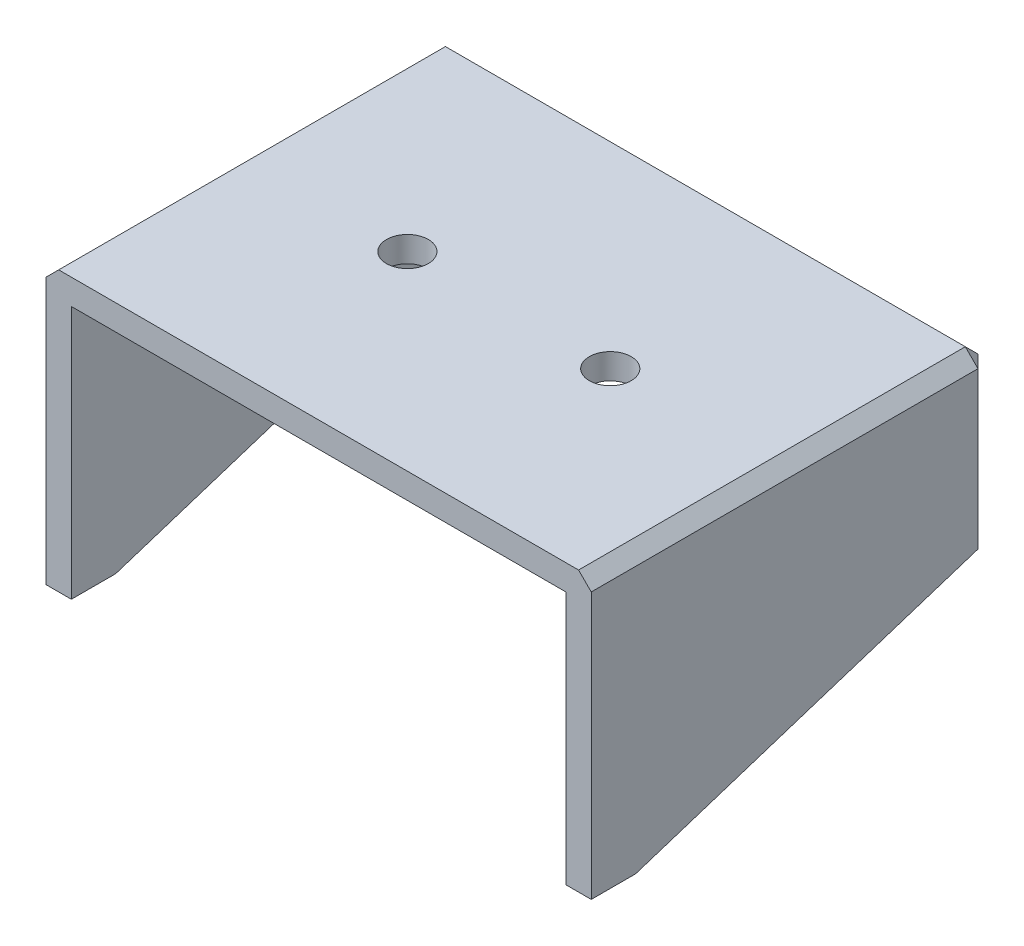
ISO-10303-21;
HEADER;
FILE_DESCRIPTION(('STEP AP214'),'2;1');
FILE_NAME('part.step','',(''),(''),'','','');
FILE_SCHEMA(('AUTOMOTIVE_DESIGN { 1 0 10303 214 1 1 1 1 }'));
ENDSEC;
DATA;
#1=APPLICATION_CONTEXT('core data for automotive mechanical design processes');
#2=APPLICATION_PROTOCOL_DEFINITION('international standard','automotive_design',2000,#1);
#3=PRODUCT_CONTEXT('',#1,'mechanical');
#4=PRODUCT('Part','Part','',(#3));
#5=PRODUCT_RELATED_PRODUCT_CATEGORY('part','',(#4));
#6=PRODUCT_DEFINITION_FORMATION('','',#4);
#7=PRODUCT_DEFINITION_CONTEXT('part definition',#1,'design');
#8=PRODUCT_DEFINITION('design','',#6,#7);
#9=PRODUCT_DEFINITION_SHAPE('','',#8);
#10=(LENGTH_UNIT() NAMED_UNIT(*) SI_UNIT(.MILLI.,.METRE.));
#11=(NAMED_UNIT(*) PLANE_ANGLE_UNIT() SI_UNIT($,.RADIAN.));
#12=(NAMED_UNIT(*) SI_UNIT($,.STERADIAN.) SOLID_ANGLE_UNIT());
#13=UNCERTAINTY_MEASURE_WITH_UNIT(LENGTH_MEASURE(1.E-05),#10,'distance_accuracy_value','');
#14=(GEOMETRIC_REPRESENTATION_CONTEXT(3) GLOBAL_UNCERTAINTY_ASSIGNED_CONTEXT((#13)) GLOBAL_UNIT_ASSIGNED_CONTEXT((#10,
#11,#12)) REPRESENTATION_CONTEXT('',''));
#15=CARTESIAN_POINT('',(0.,0.,0.));
#16=DIRECTION('',(0.,0.,1.));
#17=DIRECTION('',(1.,0.,0.));
#18=AXIS2_PLACEMENT_3D('',#15,#16,#17);
#19=CARTESIAN_POINT('',(0.,0.,0.));
#20=DIRECTION('',(0.,1.,0.));
#21=DIRECTION('',(0.,0.,1.));
#22=AXIS2_PLACEMENT_3D('',#19,#20,#21);
#23=PLANE('',#22);
#24=CARTESIAN_POINT('',(8.,0.,6.01690821256042));
#25=DIRECTION('',(0.,-1.,0.));
#26=DIRECTION('',(0.,0.,-1.));
#27=AXIS2_PLACEMENT_3D('',#24,#25,#26);
#28=CIRCLE('',#27,1.65);
#29=CARTESIAN_POINT('',(8.,0.,4.36690821256042));
#30=VERTEX_POINT('',#29);
#31=EDGE_CURVE('E198',#30,#30,#28,.T.);
#32=ORIENTED_EDGE('',*,*,#31,.F.);
#33=EDGE_LOOP('',(#32));
#34=FACE_BOUND('',#33,.T.);
#35=CARTESIAN_POINT('',(-8.,0.,6.01690821256042));
#36=DIRECTION('',(0.,-1.,0.));
#37=DIRECTION('',(0.,0.,-1.));
#38=AXIS2_PLACEMENT_3D('',#35,#36,#37);
#39=CIRCLE('',#38,1.65);
#40=CARTESIAN_POINT('',(-8.,0.,4.36690821256042));
#41=VERTEX_POINT('',#40);
#42=EDGE_CURVE('E202',#41,#41,#39,.T.);
#43=ORIENTED_EDGE('',*,*,#42,.F.);
#44=EDGE_LOOP('',(#43));
#45=FACE_BOUND('',#44,.T.);
#46=DIRECTION('',(-1.,0.,0.));
#47=VECTOR('',#46,1.);
#48=CARTESIAN_POINT('',(19.5,0.,-8.98309178743959));
#49=LINE('',#48,#47);
#50=CARTESIAN_POINT('',(19.5,0.,-8.98309178743959));
#51=VERTEX_POINT('',#50);
#52=CARTESIAN_POINT('',(-19.5,0.,-8.98309178743959));
#53=VERTEX_POINT('',#52);
#54=EDGE_CURVE('E206',#51,#53,#49,.T.);
#55=ORIENTED_EDGE('',*,*,#54,.F.);
#56=DIRECTION('',(0.,0.,-1.));
#57=VECTOR('',#56,1.);
#58=CARTESIAN_POINT('',(19.5,0.,21.0169082125604));
#59=LINE('',#58,#57);
#60=CARTESIAN_POINT('',(19.5,0.,21.0169082125604));
#61=VERTEX_POINT('',#60);
#62=EDGE_CURVE('E220',#61,#51,#59,.T.);
#63=ORIENTED_EDGE('',*,*,#62,.F.);
#64=DIRECTION('',(1.,0.,0.));
#65=VECTOR('',#64,1.);
#66=CARTESIAN_POINT('',(-21.5,0.,21.0169082125604));
#67=LINE('',#66,#65);
#68=CARTESIAN_POINT('',(-19.5,0.,21.0169082125604));
#69=VERTEX_POINT('',#68);
#70=EDGE_CURVE('E241',#69,#61,#67,.T.);
#71=ORIENTED_EDGE('',*,*,#70,.F.);
#72=DIRECTION('',(0.,0.,-1.));
#73=VECTOR('',#72,1.);
#74=CARTESIAN_POINT('',(-19.5,0.,21.0169082125604));
#75=LINE('',#74,#73);
#76=EDGE_CURVE('E217',#69,#53,#75,.T.);
#77=ORIENTED_EDGE('',*,*,#76,.T.);
#78=EDGE_LOOP('',(#55,#63,#71,#77));
#79=FACE_BOUND('',#78,.T.);
#80=ADVANCED_FACE('F37',(#34,#45,#79),#23,.F.);
#81=CARTESIAN_POINT('',(19.5,-20.,21.0169082125604));
#82=DIRECTION('',(1.,0.,0.));
#83=DIRECTION('',(0.,0.,-1.));
#84=AXIS2_PLACEMENT_3D('',#81,#82,#83);
#85=PLANE('',#84);
#86=DIRECTION('',(0.,1.,0.));
#87=VECTOR('',#86,1.);
#88=CARTESIAN_POINT('',(19.5,-11.,-8.98309178743959));
#89=LINE('',#88,#87);
#90=CARTESIAN_POINT('',(19.5,-7.,-8.98309178743959));
#91=VERTEX_POINT('',#90);
#92=EDGE_CURVE('E212',#91,#51,#89,.T.);
#93=ORIENTED_EDGE('',*,*,#92,.F.);
#94=DIRECTION('',(0.,0.,-1.));
#95=VECTOR('',#94,1.);
#96=CARTESIAN_POINT('',(19.5,-7.,-0.483091787439589));
#97=LINE('',#96,#95);
#98=CARTESIAN_POINT('',(19.5,-7.,-10.4830917874396));
#99=VERTEX_POINT('',#98);
#100=EDGE_CURVE('E157',#91,#99,#97,.T.);
#101=ORIENTED_EDGE('',*,*,#100,.T.);
#102=DIRECTION('',(0.,-1.,0.));
#103=VECTOR('',#102,1.);
#104=CARTESIAN_POINT('',(19.5,-11.,-10.4830917874396));
#105=LINE('',#104,#103);
#106=CARTESIAN_POINT('',(19.5,-11.,-10.4830917874396));
#107=VERTEX_POINT('',#106);
#108=EDGE_CURVE('E151',#99,#107,#105,.T.);
#109=ORIENTED_EDGE('',*,*,#108,.T.);
#110=DIRECTION('',(0.,-0.306009180413121,0.952028561285264));
#111=VECTOR('',#110,1.);
#112=CARTESIAN_POINT('',(19.5,-21.0196531791908,20.6891625478205));
#113=LINE('',#112,#111);
#114=CARTESIAN_POINT('',(19.5,-20.,17.5169082125604));
#115=VERTEX_POINT('',#114);
#116=EDGE_CURVE('E155',#107,#115,#113,.T.);
#117=ORIENTED_EDGE('',*,*,#116,.T.);
#118=DIRECTION('',(0.,0.,-1.));
#119=VECTOR('',#118,1.);
#120=CARTESIAN_POINT('',(19.5,-20.,21.0169082125604));
#121=LINE('',#120,#119);
#122=CARTESIAN_POINT('',(19.5,-20.,21.0169082125604));
#123=VERTEX_POINT('',#122);
#124=EDGE_CURVE('E229',#123,#115,#121,.T.);
#125=ORIENTED_EDGE('',*,*,#124,.F.);
#126=DIRECTION('',(0.,1.,0.));
#127=VECTOR('',#126,1.);
#128=CARTESIAN_POINT('',(19.5,-20.,21.0169082125604));
#129=LINE('',#128,#127);
#130=EDGE_CURVE('E236',#123,#61,#129,.T.);
#131=ORIENTED_EDGE('',*,*,#130,.T.);
#132=ORIENTED_EDGE('',*,*,#62,.T.);
#133=EDGE_LOOP('',(#93,#101,#109,#117,#125,#131,#132));
#134=FACE_BOUND('',#133,.T.);
#135=ADVANCED_FACE('F153',(#134),#85,.F.);
#136=CARTESIAN_POINT('',(-19.5,-20.,21.0169082125604));
#137=DIRECTION('',(1.,0.,0.));
#138=DIRECTION('',(0.,0.,-1.));
#139=AXIS2_PLACEMENT_3D('',#136,#137,#138);
#140=PLANE('',#139);
#141=DIRECTION('',(0.,0.,-1.));
#142=VECTOR('',#141,1.);
#143=CARTESIAN_POINT('',(-19.5,-7.,-0.483091787439589));
#144=LINE('',#143,#142);
#145=CARTESIAN_POINT('',(-19.5,-7.,-8.98309178743959));
#146=VERTEX_POINT('',#145);
#147=CARTESIAN_POINT('',(-19.5,-7.,-10.4830917874396));
#148=VERTEX_POINT('',#147);
#149=EDGE_CURVE('E177',#146,#148,#144,.T.);
#150=ORIENTED_EDGE('',*,*,#149,.F.);
#151=DIRECTION('',(0.,1.,0.));
#152=VECTOR('',#151,1.);
#153=CARTESIAN_POINT('',(-19.5,-11.,-8.98309178743959));
#154=LINE('',#153,#152);
#155=EDGE_CURVE('E209',#146,#53,#154,.T.);
#156=ORIENTED_EDGE('',*,*,#155,.T.);
#157=ORIENTED_EDGE('',*,*,#76,.F.);
#158=DIRECTION('',(0.,1.,0.));
#159=VECTOR('',#158,1.);
#160=CARTESIAN_POINT('',(-19.5,-20.,21.0169082125604));
#161=LINE('',#160,#159);
#162=CARTESIAN_POINT('',(-19.5,-20.,21.0169082125604));
#163=VERTEX_POINT('',#162);
#164=EDGE_CURVE('E214',#163,#69,#161,.T.);
#165=ORIENTED_EDGE('',*,*,#164,.F.);
#166=DIRECTION('',(0.,0.,-1.));
#167=VECTOR('',#166,1.);
#168=CARTESIAN_POINT('',(-19.5,-20.,21.0169082125604));
#169=LINE('',#168,#167);
#170=CARTESIAN_POINT('',(-19.5,-20.,17.5169082125604));
#171=VERTEX_POINT('',#170);
#172=EDGE_CURVE('E221',#163,#171,#169,.T.);
#173=ORIENTED_EDGE('',*,*,#172,.T.);
#174=DIRECTION('',(0.,-0.306009180413121,0.952028561285264));
#175=VECTOR('',#174,1.);
#176=CARTESIAN_POINT('',(-19.5,-21.0196531791908,20.6891625478205));
#177=LINE('',#176,#175);
#178=CARTESIAN_POINT('',(-19.5,-11.,-10.4830917874396));
#179=VERTEX_POINT('',#178);
#180=EDGE_CURVE('E167',#179,#171,#177,.T.);
#181=ORIENTED_EDGE('',*,*,#180,.F.);
#182=DIRECTION('',(0.,1.,0.));
#183=VECTOR('',#182,1.);
#184=CARTESIAN_POINT('',(-19.5,-11.,-10.4830917874396));
#185=LINE('',#184,#183);
#186=EDGE_CURVE('E161',#179,#148,#185,.T.);
#187=ORIENTED_EDGE('',*,*,#186,.T.);
#188=EDGE_LOOP('',(#150,#156,#157,#165,#173,#181,#187));
#189=FACE_BOUND('',#188,.T.);
#190=ADVANCED_FACE('F345',(#189),#140,.T.);
#191=CARTESIAN_POINT('',(-21.5,2.,-10.4830917874396));
#192=DIRECTION('',(1.,0.,0.));
#193=DIRECTION('',(0.,0.,-1.));
#194=AXIS2_PLACEMENT_3D('',#191,#192,#193);
#195=PLANE('',#194);
#196=DIRECTION('',(0.,-1.,0.));
#197=VECTOR('',#196,1.);
#198=CARTESIAN_POINT('',(-21.5,2.,-9.48309178743959));
#199=LINE('',#198,#197);
#200=CARTESIAN_POINT('',(-21.5,0.999999999999992,-9.48309178743959));
#201=VERTEX_POINT('',#200);
#202=CARTESIAN_POINT('',(-21.5,-11.3214285714286,-9.48309178743959));
#203=VERTEX_POINT('',#202);
#204=EDGE_CURVE('E260',#201,#203,#199,.T.);
#205=ORIENTED_EDGE('',*,*,#204,.T.);
#206=DIRECTION('',(0.,-0.306009180413121,0.952028561285264));
#207=VECTOR('',#206,1.);
#208=CARTESIAN_POINT('',(-21.5,-9.78265895953757,-14.2703750244338));
#209=LINE('',#208,#207);
#210=CARTESIAN_POINT('',(-21.5,-20.,17.5169082125604));
#211=VERTEX_POINT('',#210);
#212=EDGE_CURVE('E60',#203,#211,#209,.T.);
#213=ORIENTED_EDGE('',*,*,#212,.T.);
#214=DIRECTION('',(0.,0.,-1.));
#215=VECTOR('',#214,1.);
#216=CARTESIAN_POINT('',(-21.5,-20.,21.0169082125604));
#217=LINE('',#216,#215);
#218=CARTESIAN_POINT('',(-21.5,-20.,21.0169082125604));
#219=VERTEX_POINT('',#218);
#220=EDGE_CURVE('E216',#219,#211,#217,.T.);
#221=ORIENTED_EDGE('',*,*,#220,.F.);
#222=DIRECTION('',(0.,-1.,0.));
#223=VECTOR('',#222,1.);
#224=CARTESIAN_POINT('',(-21.5,2.,21.0169082125604));
#225=LINE('',#224,#223);
#226=CARTESIAN_POINT('',(-21.5,0.999999999999992,21.0169082125604));
#227=VERTEX_POINT('',#226);
#228=EDGE_CURVE('E248',#227,#219,#225,.T.);
#229=ORIENTED_EDGE('',*,*,#228,.F.);
#230=DIRECTION('',(0.,0.,-1.));
#231=VECTOR('',#230,1.);
#232=CARTESIAN_POINT('',(-21.5,0.999999999999992,-10.4830917874396));
#233=LINE('',#232,#231);
#234=EDGE_CURVE('E250',#227,#201,#233,.T.);
#235=ORIENTED_EDGE('',*,*,#234,.T.);
#236=EDGE_LOOP('',(#205,#213,#221,#229,#235));
#237=FACE_BOUND('',#236,.T.);
#238=ADVANCED_FACE('F353',(#237),#195,.F.);
#239=CARTESIAN_POINT('',(-21.5,2.,21.0169082125604));
#240=DIRECTION('',(0.,0.,-1.));
#241=DIRECTION('',(-1.,0.,0.));
#242=AXIS2_PLACEMENT_3D('',#239,#240,#241);
#243=PLANE('',#242);
#244=DIRECTION('',(1.,0.,0.));
#245=VECTOR('',#244,1.);
#246=CARTESIAN_POINT('',(-21.5,2.,21.0169082125604));
#247=LINE('',#246,#245);
#248=CARTESIAN_POINT('',(-20.5,2.,21.0169082125604));
#249=VERTEX_POINT('',#248);
#250=CARTESIAN_POINT('',(20.5,2.,21.0169082125604));
#251=VERTEX_POINT('',#250);
#252=EDGE_CURVE('E242',#249,#251,#247,.T.);
#253=ORIENTED_EDGE('',*,*,#252,.F.);
#254=DIRECTION('',(-0.707106781186545,-0.70710678118655,0.));
#255=VECTOR('',#254,1.);
#256=CARTESIAN_POINT('',(-20.5,2.,21.0169082125604));
#257=LINE('',#256,#255);
#258=EDGE_CURVE('E276',#249,#227,#257,.T.);
#259=ORIENTED_EDGE('',*,*,#258,.T.);
#260=ORIENTED_EDGE('',*,*,#228,.T.);
#261=DIRECTION('',(1.,0.,0.));
#262=VECTOR('',#261,1.);
#263=CARTESIAN_POINT('',(-21.5,-20.,21.0169082125604));
#264=LINE('',#263,#262);
#265=EDGE_CURVE('E224',#219,#163,#264,.T.);
#266=ORIENTED_EDGE('',*,*,#265,.T.);
#267=ORIENTED_EDGE('',*,*,#164,.T.);
#268=ORIENTED_EDGE('',*,*,#70,.T.);
#269=ORIENTED_EDGE('',*,*,#130,.F.);
#270=DIRECTION('',(-1.,0.,0.));
#271=VECTOR('',#270,1.);
#272=CARTESIAN_POINT('',(21.5,-20.,21.0169082125604));
#273=LINE('',#272,#271);
#274=CARTESIAN_POINT('',(21.5,-20.,21.0169082125604));
#275=VERTEX_POINT('',#274);
#276=EDGE_CURVE('E231',#275,#123,#273,.T.);
#277=ORIENTED_EDGE('',*,*,#276,.F.);
#278=DIRECTION('',(0.,-1.,0.));
#279=VECTOR('',#278,1.);
#280=CARTESIAN_POINT('',(21.5,2.,21.0169082125604));
#281=LINE('',#280,#279);
#282=CARTESIAN_POINT('',(21.5,0.999999999999992,21.0169082125604));
#283=VERTEX_POINT('',#282);
#284=EDGE_CURVE('E245',#283,#275,#281,.T.);
#285=ORIENTED_EDGE('',*,*,#284,.F.);
#286=DIRECTION('',(-0.707106781186545,0.70710678118655,0.));
#287=VECTOR('',#286,1.);
#288=CARTESIAN_POINT('',(20.5,2.,21.0169082125604));
#289=LINE('',#288,#287);
#290=EDGE_CURVE('E274',#283,#251,#289,.T.);
#291=ORIENTED_EDGE('',*,*,#290,.T.);
#292=EDGE_LOOP('',(#253,#259,#260,#266,#267,#268,#269,#277,#285,#291));
#293=FACE_BOUND('',#292,.T.);
#294=ADVANCED_FACE('F332',(#293),#243,.F.);
#295=CARTESIAN_POINT('',(21.5,2.,-10.4830917874396));
#296=DIRECTION('',(-1.,0.,0.));
#297=DIRECTION('',(0.,0.,1.));
#298=AXIS2_PLACEMENT_3D('',#295,#296,#297);
#299=PLANE('',#298);
#300=DIRECTION('',(0.,0.,-1.));
#301=VECTOR('',#300,1.);
#302=CARTESIAN_POINT('',(21.5,-20.,21.0169082125604));
#303=LINE('',#302,#301);
#304=CARTESIAN_POINT('',(21.5,-20.,17.5169082125604));
#305=VERTEX_POINT('',#304);
#306=EDGE_CURVE('E233',#275,#305,#303,.T.);
#307=ORIENTED_EDGE('',*,*,#306,.T.);
#308=DIRECTION('',(0.,0.306009180413121,-0.952028561285264));
#309=VECTOR('',#308,1.);
#310=CARTESIAN_POINT('',(21.5,-9.78265895953757,-14.2703750244338));
#311=LINE('',#310,#309);
#312=CARTESIAN_POINT('',(21.5,-11.3214285714286,-9.48309178743958));
#313=VERTEX_POINT('',#312);
#314=EDGE_CURVE('E186',#305,#313,#311,.T.);
#315=ORIENTED_EDGE('',*,*,#314,.T.);
#316=DIRECTION('',(0.,1.,0.));
#317=VECTOR('',#316,1.);
#318=CARTESIAN_POINT('',(21.5,2.,-9.48309178743958));
#319=LINE('',#318,#317);
#320=CARTESIAN_POINT('',(21.5,0.999999999999992,-9.48309178743958));
#321=VERTEX_POINT('',#320);
#322=EDGE_CURVE('E280',#313,#321,#319,.T.);
#323=ORIENTED_EDGE('',*,*,#322,.T.);
#324=DIRECTION('',(0.,0.,1.));
#325=VECTOR('',#324,1.);
#326=CARTESIAN_POINT('',(21.5,0.999999999999992,21.0169082125604));
#327=LINE('',#326,#325);
#328=EDGE_CURVE('E278',#321,#283,#327,.T.);
#329=ORIENTED_EDGE('',*,*,#328,.T.);
#330=ORIENTED_EDGE('',*,*,#284,.T.);
#331=EDGE_LOOP('',(#307,#315,#323,#329,#330));
#332=FACE_BOUND('',#331,.T.);
#333=ADVANCED_FACE('F328',(#332),#299,.F.);
#334=CARTESIAN_POINT('',(-21.5,2.,-10.4830917874396));
#335=DIRECTION('',(0.,0.,1.));
#336=DIRECTION('',(1.,0.,0.));
#337=AXIS2_PLACEMENT_3D('',#334,#335,#336);
#338=PLANE('',#337);
#339=DIRECTION('',(1.,0.,0.));
#340=VECTOR('',#339,1.);
#341=CARTESIAN_POINT('',(-69.5,-11.,-10.4830917874396));
#342=LINE('',#341,#340);
#343=CARTESIAN_POINT('',(20.5,-11.,-10.4830917874396));
#344=VERTEX_POINT('',#343);
#345=EDGE_CURVE('E52',#107,#344,#342,.T.);
#346=ORIENTED_EDGE('',*,*,#345,.F.);
#347=ORIENTED_EDGE('',*,*,#108,.F.);
#348=DIRECTION('',(1.,0.,0.));
#349=VECTOR('',#348,1.);
#350=CARTESIAN_POINT('',(19.5,-7.,-10.4830917874396));
#351=LINE('',#350,#349);
#352=EDGE_CURVE('E585',#148,#99,#351,.T.);
#353=ORIENTED_EDGE('',*,*,#352,.F.);
#354=ORIENTED_EDGE('',*,*,#186,.F.);
#355=CARTESIAN_POINT('',(-20.5,-11.,-10.4830917874396));
#356=VERTEX_POINT('',#355);
#357=EDGE_CURVE('E174',#356,#179,#342,.T.);
#358=ORIENTED_EDGE('',*,*,#357,.F.);
#359=DIRECTION('',(0.,1.,0.));
#360=VECTOR('',#359,1.);
#361=CARTESIAN_POINT('',(-20.5,2.,-10.4830917874396));
#362=LINE('',#361,#360);
#363=CARTESIAN_POINT('',(-20.5,0.999999999999992,-10.4830917874396));
#364=VERTEX_POINT('',#363);
#365=EDGE_CURVE('E266',#356,#364,#362,.T.);
#366=ORIENTED_EDGE('',*,*,#365,.T.);
#367=DIRECTION('',(1.,0.,0.));
#368=VECTOR('',#367,1.);
#369=CARTESIAN_POINT('',(21.5,0.999999999999992,-10.4830917874396));
#370=LINE('',#369,#368);
#371=CARTESIAN_POINT('',(20.5,0.999999999999992,-10.4830917874396));
#372=VERTEX_POINT('',#371);
#373=EDGE_CURVE('E263',#364,#372,#370,.T.);
#374=ORIENTED_EDGE('',*,*,#373,.T.);
#375=DIRECTION('',(0.,-1.,0.));
#376=VECTOR('',#375,1.);
#377=CARTESIAN_POINT('',(20.5,2.,-10.4830917874396));
#378=LINE('',#377,#376);
#379=EDGE_CURVE('E173',#372,#344,#378,.T.);
#380=ORIENTED_EDGE('',*,*,#379,.T.);
#381=EDGE_LOOP('',(#346,#347,#353,#354,#358,#366,#374,#380));
#382=FACE_BOUND('',#381,.T.);
#383=CARTESIAN_POINT('',(13.,-3.,-10.4830917874396));
#384=DIRECTION('',(0.,0.,-1.));
#385=DIRECTION('',(-1.,0.,0.));
#386=AXIS2_PLACEMENT_3D('',#383,#384,#385);
#387=CIRCLE('',#386,1.5);
#388=CARTESIAN_POINT('',(11.5,-3.,-10.4830917874396));
#389=VERTEX_POINT('',#388);
#390=EDGE_CURVE('E190',#389,#389,#387,.T.);
#391=ORIENTED_EDGE('',*,*,#390,.F.);
#392=EDGE_LOOP('',(#391));
#393=FACE_BOUND('',#392,.T.);
#394=CARTESIAN_POINT('',(-13.,-3.,-10.4830917874396));
#395=DIRECTION('',(0.,0.,-1.));
#396=DIRECTION('',(-1.,0.,0.));
#397=AXIS2_PLACEMENT_3D('',#394,#395,#396);
#398=CIRCLE('',#397,1.5);
#399=CARTESIAN_POINT('',(-14.5,-3.,-10.4830917874396));
#400=VERTEX_POINT('',#399);
#401=EDGE_CURVE('E194',#400,#400,#398,.T.);
#402=ORIENTED_EDGE('',*,*,#401,.F.);
#403=EDGE_LOOP('',(#402));
#404=FACE_BOUND('',#403,.T.);
#405=ADVANCED_FACE('F170',(#382,#393,#404),#338,.F.);
#406=CARTESIAN_POINT('',(0.,2.,0.));
#407=DIRECTION('',(0.,1.,0.));
#408=DIRECTION('',(0.,0.,1.));
#409=AXIS2_PLACEMENT_3D('',#406,#407,#408);
#410=PLANE('',#409);
#411=CARTESIAN_POINT('',(8.,2.,6.01690821256042));
#412=DIRECTION('',(0.,1.,0.));
#413=DIRECTION('',(0.,0.,1.));
#414=AXIS2_PLACEMENT_3D('',#411,#412,#413);
#415=CIRCLE('',#414,1.65);
#416=CARTESIAN_POINT('',(8.,2.,7.66690821256042));
#417=VERTEX_POINT('',#416);
#418=EDGE_CURVE('E210',#417,#417,#415,.T.);
#419=ORIENTED_EDGE('',*,*,#418,.F.);
#420=EDGE_LOOP('',(#419));
#421=FACE_BOUND('',#420,.T.);
#422=CARTESIAN_POINT('',(-8.,2.,6.01690821256042));
#423=DIRECTION('',(0.,1.,0.));
#424=DIRECTION('',(0.,0.,1.));
#425=AXIS2_PLACEMENT_3D('',#422,#423,#424);
#426=CIRCLE('',#425,1.65);
#427=CARTESIAN_POINT('',(-8.,2.,7.66690821256042));
#428=VERTEX_POINT('',#427);
#429=EDGE_CURVE('E201',#428,#428,#426,.T.);
#430=ORIENTED_EDGE('',*,*,#429,.F.);
#431=EDGE_LOOP('',(#430));
#432=FACE_BOUND('',#431,.T.);
#433=DIRECTION('',(-1.,0.,0.));
#434=VECTOR('',#433,1.);
#435=CARTESIAN_POINT('',(-21.5,2.,-9.48309178743959));
#436=LINE('',#435,#434);
#437=CARTESIAN_POINT('',(20.5,2.,-9.48309178743959));
#438=VERTEX_POINT('',#437);
#439=CARTESIAN_POINT('',(-20.5,2.,-9.48309178743959));
#440=VERTEX_POINT('',#439);
#441=EDGE_CURVE('E270',#438,#440,#436,.T.);
#442=ORIENTED_EDGE('',*,*,#441,.T.);
#443=DIRECTION('',(0.,0.,1.));
#444=VECTOR('',#443,1.);
#445=CARTESIAN_POINT('',(-20.5,2.,21.0169082125604));
#446=LINE('',#445,#444);
#447=EDGE_CURVE('E272',#440,#249,#446,.T.);
#448=ORIENTED_EDGE('',*,*,#447,.T.);
#449=ORIENTED_EDGE('',*,*,#252,.T.);
#450=DIRECTION('',(0.,0.,-1.));
#451=VECTOR('',#450,1.);
#452=CARTESIAN_POINT('',(20.5,2.,-10.4830917874396));
#453=LINE('',#452,#451);
#454=EDGE_CURVE('E268',#251,#438,#453,.T.);
#455=ORIENTED_EDGE('',*,*,#454,.T.);
#456=EDGE_LOOP('',(#442,#448,#449,#455));
#457=FACE_BOUND('',#456,.T.);
#458=ADVANCED_FACE('F358',(#421,#432,#457),#410,.T.);
#459=CARTESIAN_POINT('',(0.,-20.,0.));
#460=DIRECTION('',(0.,-1.,0.));
#461=DIRECTION('',(0.,0.,-1.));
#462=AXIS2_PLACEMENT_3D('',#459,#460,#461);
#463=PLANE('',#462);
#464=DIRECTION('',(1.,0.,0.));
#465=VECTOR('',#464,1.);
#466=CARTESIAN_POINT('',(-69.5,-20.,17.5169082125604));
#467=LINE('',#466,#465);
#468=EDGE_CURVE('E165',#115,#305,#467,.T.);
#469=ORIENTED_EDGE('',*,*,#468,.T.);
#470=ORIENTED_EDGE('',*,*,#306,.F.);
#471=ORIENTED_EDGE('',*,*,#276,.T.);
#472=ORIENTED_EDGE('',*,*,#124,.T.);
#473=EDGE_LOOP('',(#469,#470,#471,#472));
#474=FACE_BOUND('',#473,.T.);
#475=ADVANCED_FACE('F336',(#474),#463,.T.);
#476=CARTESIAN_POINT('',(0.,-20.,0.));
#477=DIRECTION('',(0.,1.,0.));
#478=DIRECTION('',(0.,0.,1.));
#479=AXIS2_PLACEMENT_3D('',#476,#477,#478);
#480=PLANE('',#479);
#481=ORIENTED_EDGE('',*,*,#220,.T.);
#482=EDGE_CURVE('E184',#211,#171,#467,.T.);
#483=ORIENTED_EDGE('',*,*,#482,.T.);
#484=ORIENTED_EDGE('',*,*,#172,.F.);
#485=ORIENTED_EDGE('',*,*,#265,.F.);
#486=EDGE_LOOP('',(#481,#483,#484,#485));
#487=FACE_BOUND('',#486,.T.);
#488=ADVANCED_FACE('F340',(#487),#480,.F.);
#489=CARTESIAN_POINT('',(19.5,-11.,-8.98309178743959));
#490=DIRECTION('',(0.,0.,-1.));
#491=DIRECTION('',(-1.,0.,0.));
#492=AXIS2_PLACEMENT_3D('',#489,#490,#491);
#493=PLANE('',#492);
#494=CARTESIAN_POINT('',(13.,-3.,-8.98309178743959));
#495=DIRECTION('',(0.,0.,-1.));
#496=DIRECTION('',(-1.,0.,0.));
#497=AXIS2_PLACEMENT_3D('',#494,#495,#496);
#498=CIRCLE('',#497,1.5);
#499=CARTESIAN_POINT('',(11.5,-3.,-8.98309178743959));
#500=VERTEX_POINT('',#499);
#501=EDGE_CURVE('E205',#500,#500,#498,.T.);
#502=ORIENTED_EDGE('',*,*,#501,.T.);
#503=EDGE_LOOP('',(#502));
#504=FACE_BOUND('',#503,.T.);
#505=CARTESIAN_POINT('',(-13.,-3.,-8.98309178743959));
#506=DIRECTION('',(0.,0.,-1.));
#507=DIRECTION('',(-1.,0.,0.));
#508=AXIS2_PLACEMENT_3D('',#505,#506,#507);
#509=CIRCLE('',#508,1.5);
#510=CARTESIAN_POINT('',(-14.5,-3.,-8.98309178743959));
#511=VERTEX_POINT('',#510);
#512=EDGE_CURVE('E193',#511,#511,#509,.T.);
#513=ORIENTED_EDGE('',*,*,#512,.T.);
#514=EDGE_LOOP('',(#513));
#515=FACE_BOUND('',#514,.T.);
#516=ORIENTED_EDGE('',*,*,#155,.F.);
#517=DIRECTION('',(1.,0.,0.));
#518=VECTOR('',#517,1.);
#519=CARTESIAN_POINT('',(19.5,-7.,-8.98309178743959));
#520=LINE('',#519,#518);
#521=EDGE_CURVE('E11',#146,#91,#520,.T.);
#522=ORIENTED_EDGE('',*,*,#521,.T.);
#523=ORIENTED_EDGE('',*,*,#92,.T.);
#524=ORIENTED_EDGE('',*,*,#54,.T.);
#525=EDGE_LOOP('',(#516,#522,#523,#524));
#526=FACE_BOUND('',#525,.T.);
#527=ADVANCED_FACE('F422',(#504,#515,#526),#493,.F.);
#528=CARTESIAN_POINT('',(-8.,12.,6.01690821256042));
#529=DIRECTION('',(0.,-1.,0.));
#530=DIRECTION('',(0.,0.,-1.));
#531=AXIS2_PLACEMENT_3D('',#528,#529,#530);
#532=CYLINDRICAL_SURFACE('',#531,1.65);
#533=ORIENTED_EDGE('',*,*,#429,.T.);
#534=EDGE_LOOP('',(#533));
#535=FACE_BOUND('',#534,.T.);
#536=ORIENTED_EDGE('',*,*,#42,.T.);
#537=EDGE_LOOP('',(#536));
#538=FACE_BOUND('',#537,.T.);
#539=ADVANCED_FACE('F418',(#535,#538),#532,.F.);
#540=CARTESIAN_POINT('',(8.,12.,6.01690821256042));
#541=DIRECTION('',(0.,-1.,0.));
#542=DIRECTION('',(0.,0.,-1.));
#543=AXIS2_PLACEMENT_3D('',#540,#541,#542);
#544=CYLINDRICAL_SURFACE('',#543,1.65);
#545=ORIENTED_EDGE('',*,*,#418,.T.);
#546=EDGE_LOOP('',(#545));
#547=FACE_BOUND('',#546,.T.);
#548=ORIENTED_EDGE('',*,*,#31,.T.);
#549=EDGE_LOOP('',(#548));
#550=FACE_BOUND('',#549,.T.);
#551=ADVANCED_FACE('F409',(#547,#550),#544,.F.);
#552=CARTESIAN_POINT('',(-13.,-3.,1.51690821256041));
#553=DIRECTION('',(0.,0.,-1.));
#554=DIRECTION('',(-1.,0.,0.));
#555=AXIS2_PLACEMENT_3D('',#552,#553,#554);
#556=CYLINDRICAL_SURFACE('',#555,1.5);
#557=ORIENTED_EDGE('',*,*,#401,.T.);
#558=EDGE_LOOP('',(#557));
#559=FACE_BOUND('',#558,.T.);
#560=ORIENTED_EDGE('',*,*,#512,.F.);
#561=EDGE_LOOP('',(#560));
#562=FACE_BOUND('',#561,.T.);
#563=ADVANCED_FACE('F403',(#559,#562),#556,.F.);
#564=CARTESIAN_POINT('',(13.,-3.,1.51690821256041));
#565=DIRECTION('',(0.,0.,-1.));
#566=DIRECTION('',(-1.,0.,0.));
#567=AXIS2_PLACEMENT_3D('',#564,#565,#566);
#568=CYLINDRICAL_SURFACE('',#567,1.5);
#569=ORIENTED_EDGE('',*,*,#390,.T.);
#570=EDGE_LOOP('',(#569));
#571=FACE_BOUND('',#570,.T.);
#572=ORIENTED_EDGE('',*,*,#501,.F.);
#573=EDGE_LOOP('',(#572));
#574=FACE_BOUND('',#573,.T.);
#575=ADVANCED_FACE('F399',(#571,#574),#568,.F.);
#576=CARTESIAN_POINT('',(20.5,2.,-10.4830917874396));
#577=DIRECTION('',(-0.70710678118655,0.,0.707106781186545));
#578=DIRECTION('',(0.,-1.,0.));
#579=AXIS2_PLACEMENT_3D('',#576,#577,#578);
#580=PLANE('',#579);
#581=DIRECTION('',(-0.68952132700899,0.221631855110034,-0.689521327008995));
#582=VECTOR('',#581,1.);
#583=CARTESIAN_POINT('',(18.5133414190418,-10.3614311704063,-12.4697503683978));
#584=LINE('',#583,#582);
#585=EDGE_CURVE('E183',#344,#313,#584,.F.);
#586=ORIENTED_EDGE('',*,*,#585,.F.);
#587=ORIENTED_EDGE('',*,*,#379,.F.);
#588=DIRECTION('',(0.707106781186545,0.,0.70710678118655));
#589=VECTOR('',#588,1.);
#590=CARTESIAN_POINT('',(21.5,0.999999999999992,-9.48309178743958));
#591=LINE('',#590,#589);
#592=EDGE_CURVE('E197',#321,#372,#591,.F.);
#593=ORIENTED_EDGE('',*,*,#592,.F.);
#594=ORIENTED_EDGE('',*,*,#322,.F.);
#595=EDGE_LOOP('',(#586,#587,#593,#594));
#596=FACE_BOUND('',#595,.T.);
#597=ADVANCED_FACE('F39',(#596),#580,.F.);
#598=CARTESIAN_POINT('',(20.5,2.,0.));
#599=DIRECTION('',(0.70710678118655,0.707106781186545,0.));
#600=DIRECTION('',(0.,0.,1.));
#601=AXIS2_PLACEMENT_3D('',#598,#599,#600);
#602=PLANE('',#601);
#603=ORIENTED_EDGE('',*,*,#290,.F.);
#604=ORIENTED_EDGE('',*,*,#328,.F.);
#605=DIRECTION('',(0.707106781186545,-0.70710678118655,0.));
#606=VECTOR('',#605,1.);
#607=CARTESIAN_POINT('',(21.5,0.999999999999992,-9.48309178743958));
#608=LINE('',#607,#606);
#609=EDGE_CURVE('E293',#438,#321,#608,.T.);
#610=ORIENTED_EDGE('',*,*,#609,.F.);
#611=ORIENTED_EDGE('',*,*,#454,.F.);
#612=EDGE_LOOP('',(#603,#604,#610,#611));
#613=FACE_BOUND('',#612,.T.);
#614=ADVANCED_FACE('F325',(#613),#602,.T.);
#615=CARTESIAN_POINT('',(21.5,0.999999999999992,-9.48309178743958));
#616=DIRECTION('',(0.57735026918963,0.577350269189622,-0.577350269189626));
#617=DIRECTION('',(-0.707106781186545,0.,-0.70710678118655));
#618=AXIS2_PLACEMENT_3D('',#615,#616,#617);
#619=PLANE('',#618);
#620=ORIENTED_EDGE('',*,*,#609,.T.);
#621=ORIENTED_EDGE('',*,*,#592,.T.);
#622=DIRECTION('',(0.,0.70710678118655,0.707106781186545));
#623=VECTOR('',#622,1.);
#624=CARTESIAN_POINT('',(20.5,1.5,-9.98309178743959));
#625=LINE('',#624,#623);
#626=EDGE_CURVE('E290',#438,#372,#625,.F.);
#627=ORIENTED_EDGE('',*,*,#626,.F.);
#628=EDGE_LOOP('',(#620,#621,#627));
#629=FACE_BOUND('',#628,.T.);
#630=ADVANCED_FACE('F319',(#629),#619,.T.);
#631=CARTESIAN_POINT('',(0.,2.,-9.48309178743959));
#632=DIRECTION('',(0.,0.707106781186545,-0.70710678118655));
#633=DIRECTION('',(1.,0.,0.));
#634=AXIS2_PLACEMENT_3D('',#631,#632,#633);
#635=PLANE('',#634);
#636=ORIENTED_EDGE('',*,*,#626,.T.);
#637=ORIENTED_EDGE('',*,*,#373,.F.);
#638=DIRECTION('',(0.,-0.70710678118655,-0.707106781186545));
#639=VECTOR('',#638,1.);
#640=CARTESIAN_POINT('',(-20.5,0.999999999999992,-10.4830917874396));
#641=LINE('',#640,#639);
#642=EDGE_CURVE('E287',#440,#364,#641,.T.);
#643=ORIENTED_EDGE('',*,*,#642,.F.);
#644=ORIENTED_EDGE('',*,*,#441,.F.);
#645=EDGE_LOOP('',(#636,#637,#643,#644));
#646=FACE_BOUND('',#645,.T.);
#647=ADVANCED_FACE('F313',(#646),#635,.T.);
#648=CARTESIAN_POINT('',(-20.5,2.,0.));
#649=DIRECTION('',(-0.70710678118655,0.707106781186545,0.));
#650=DIRECTION('',(0.,0.,-1.));
#651=AXIS2_PLACEMENT_3D('',#648,#649,#650);
#652=PLANE('',#651);
#653=ORIENTED_EDGE('',*,*,#258,.F.);
#654=ORIENTED_EDGE('',*,*,#447,.F.);
#655=DIRECTION('',(0.707106781186545,0.70710678118655,0.));
#656=VECTOR('',#655,1.);
#657=CARTESIAN_POINT('',(-21.,1.5,-9.48309178743959));
#658=LINE('',#657,#656);
#659=EDGE_CURVE('E284',#201,#440,#658,.T.);
#660=ORIENTED_EDGE('',*,*,#659,.F.);
#661=ORIENTED_EDGE('',*,*,#234,.F.);
#662=EDGE_LOOP('',(#653,#654,#660,#661));
#663=FACE_BOUND('',#662,.T.);
#664=ADVANCED_FACE('F356',(#663),#652,.T.);
#665=CARTESIAN_POINT('',(-20.5,0.999999999999992,-10.4830917874396));
#666=DIRECTION('',(-0.577350269189626,0.577350269189622,-0.57735026918963));
#667=DIRECTION('',(-0.70710678118655,0.,0.707106781186545));
#668=AXIS2_PLACEMENT_3D('',#665,#666,#667);
#669=PLANE('',#668);
#670=ORIENTED_EDGE('',*,*,#659,.T.);
#671=ORIENTED_EDGE('',*,*,#642,.T.);
#672=DIRECTION('',(0.70710678118655,0.,-0.707106781186545));
#673=VECTOR('',#672,1.);
#674=CARTESIAN_POINT('',(-20.5,0.999999999999992,-10.4830917874396));
#675=LINE('',#674,#673);
#676=EDGE_CURVE('E166',#201,#364,#675,.T.);
#677=ORIENTED_EDGE('',*,*,#676,.F.);
#678=EDGE_LOOP('',(#670,#671,#677));
#679=FACE_BOUND('',#678,.T.);
#680=ADVANCED_FACE('F308',(#679),#669,.T.);
#681=CARTESIAN_POINT('',(-21.5,2.,-9.48309178743959));
#682=DIRECTION('',(0.707106781186545,0.,0.70710678118655));
#683=DIRECTION('',(0.,-1.,0.));
#684=AXIS2_PLACEMENT_3D('',#681,#682,#683);
#685=PLANE('',#684);
#686=DIRECTION('',(-0.689521327008995,-0.221631855110033,0.689521327008991));
#687=VECTOR('',#686,1.);
#688=CARTESIAN_POINT('',(-19.4642207398423,-10.6670709520922,-11.5188710475972));
#689=LINE('',#688,#687);
#690=EDGE_CURVE('E45',#203,#356,#689,.F.);
#691=ORIENTED_EDGE('',*,*,#690,.F.);
#692=ORIENTED_EDGE('',*,*,#204,.F.);
#693=ORIENTED_EDGE('',*,*,#676,.T.);
#694=ORIENTED_EDGE('',*,*,#365,.F.);
#695=EDGE_LOOP('',(#691,#692,#693,#694));
#696=FACE_BOUND('',#695,.T.);
#697=ADVANCED_FACE('F305',(#696),#685,.F.);
#698=CARTESIAN_POINT('',(-69.5,-11.,-10.4830917874396));
#699=DIRECTION('',(0.,0.952028561285264,0.306009180413121));
#700=DIRECTION('',(0.,-0.306009180413121,0.952028561285264));
#701=AXIS2_PLACEMENT_3D('',#698,#699,#700);
#702=PLANE('',#701);
#703=ORIENTED_EDGE('',*,*,#180,.T.);
#704=ORIENTED_EDGE('',*,*,#482,.F.);
#705=ORIENTED_EDGE('',*,*,#212,.F.);
#706=ORIENTED_EDGE('',*,*,#690,.T.);
#707=ORIENTED_EDGE('',*,*,#357,.T.);
#708=EDGE_LOOP('',(#703,#704,#705,#706,#707));
#709=FACE_BOUND('',#708,.T.);
#710=ADVANCED_FACE('F298',(#709),#702,.F.);
#711=ORIENTED_EDGE('',*,*,#345,.T.);
#712=ORIENTED_EDGE('',*,*,#585,.T.);
#713=ORIENTED_EDGE('',*,*,#314,.F.);
#714=ORIENTED_EDGE('',*,*,#468,.F.);
#715=ORIENTED_EDGE('',*,*,#116,.F.);
#716=EDGE_LOOP('',(#711,#712,#713,#714,#715));
#717=FACE_BOUND('',#716,.T.);
#718=ADVANCED_FACE('F163',(#717),#702,.F.);
#719=CARTESIAN_POINT('',(19.5,-7.,-0.483091787439589));
#720=DIRECTION('',(0.,1.,0.));
#721=DIRECTION('',(0.,0.,1.));
#722=AXIS2_PLACEMENT_3D('',#719,#720,#721);
#723=PLANE('',#722);
#724=ORIENTED_EDGE('',*,*,#149,.T.);
#725=ORIENTED_EDGE('',*,*,#352,.T.);
#726=ORIENTED_EDGE('',*,*,#100,.F.);
#727=ORIENTED_EDGE('',*,*,#521,.F.);
#728=EDGE_LOOP('',(#724,#725,#726,#727));
#729=FACE_BOUND('',#728,.T.);
#730=ADVANCED_FACE('F577',(#729),#723,.F.);
#731=CLOSED_SHELL('',(#80,#135,#190,#238,#294,#333,#405,#458,#475,#488,#527,#539,#551,#563,#575,
#597,#614,#630,#647,#664,#680,#697,#710,#718,#730));
#732=MANIFOLD_SOLID_BREP('B2',#731);
#733=ADVANCED_BREP_SHAPE_REPRESENTATION('',(#18,#732),#14);
#734=SHAPE_DEFINITION_REPRESENTATION(#9,#733);
ENDSEC;
END-ISO-10303-21;
